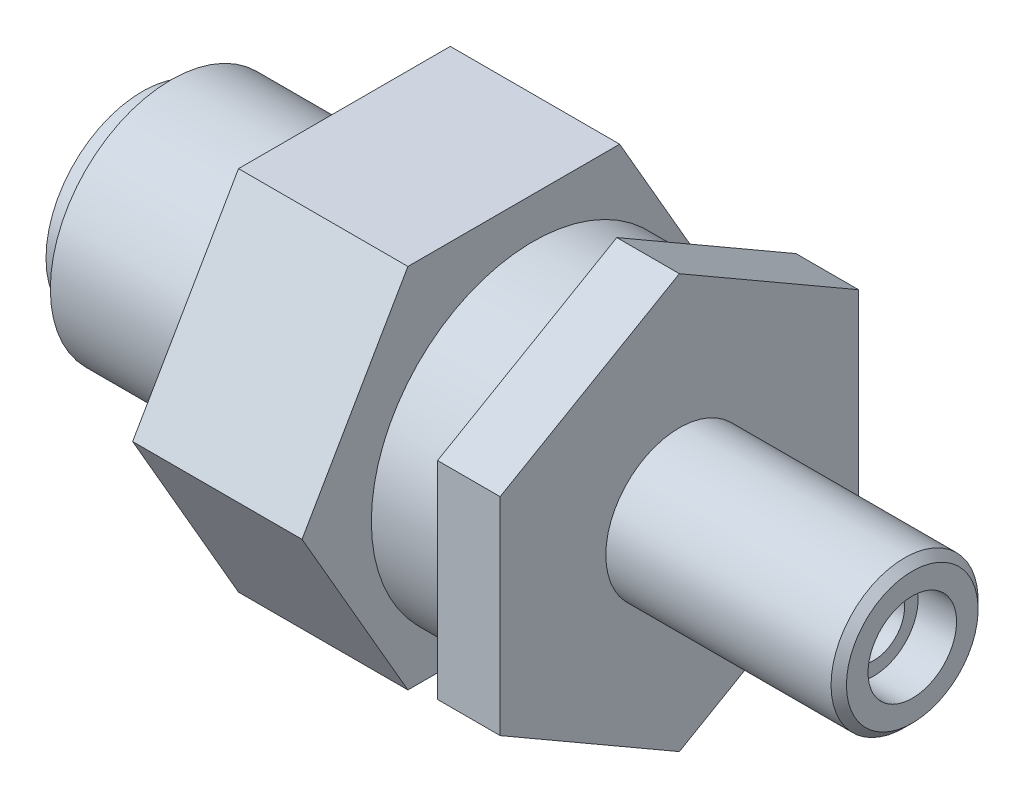
ISO-10303-21;
HEADER;
FILE_DESCRIPTION(('STEP AP214'),'2;1');
FILE_NAME('part.step','',(''),(''),'','','');
FILE_SCHEMA(('AUTOMOTIVE_DESIGN { 1 0 10303 214 1 1 1 1 }'));
ENDSEC;
DATA;
#1=APPLICATION_CONTEXT('core data for automotive mechanical design processes');
#2=APPLICATION_PROTOCOL_DEFINITION('international standard','automotive_design',2000,#1);
#3=PRODUCT_CONTEXT('',#1,'mechanical');
#4=PRODUCT('Part','Part','',(#3));
#5=PRODUCT_RELATED_PRODUCT_CATEGORY('part','',(#4));
#6=PRODUCT_DEFINITION_FORMATION('','',#4);
#7=PRODUCT_DEFINITION_CONTEXT('part definition',#1,'design');
#8=PRODUCT_DEFINITION('design','',#6,#7);
#9=PRODUCT_DEFINITION_SHAPE('','',#8);
#10=(LENGTH_UNIT() NAMED_UNIT(*) SI_UNIT(.MILLI.,.METRE.));
#11=(NAMED_UNIT(*) PLANE_ANGLE_UNIT() SI_UNIT($,.RADIAN.));
#12=(NAMED_UNIT(*) SI_UNIT($,.STERADIAN.) SOLID_ANGLE_UNIT());
#13=UNCERTAINTY_MEASURE_WITH_UNIT(LENGTH_MEASURE(1.E-05),#10,'distance_accuracy_value','');
#14=(GEOMETRIC_REPRESENTATION_CONTEXT(3) GLOBAL_UNCERTAINTY_ASSIGNED_CONTEXT((#13)) GLOBAL_UNIT_ASSIGNED_CONTEXT((#10,
#11,#12)) REPRESENTATION_CONTEXT('',''));
#15=CARTESIAN_POINT('',(0.,0.,0.));
#16=DIRECTION('',(0.,0.,1.));
#17=DIRECTION('',(1.,0.,0.));
#18=AXIS2_PLACEMENT_3D('',#15,#16,#17);
#19=CARTESIAN_POINT('',(10.5000000000003,8.00000000000002,-9.99200722162641E-13));
#20=DIRECTION('',(1.,0.,0.));
#21=DIRECTION('',(0.,0.,-0.999999999999998));
#22=AXIS2_PLACEMENT_3D('',#19,#20,#21);
#23=PLANE('',#22);
#24=CARTESIAN_POINT('',(10.5000000000009,0.,-3.33066907387547E-13));
#25=DIRECTION('',(-1.,0.,0.));
#26=DIRECTION('',(0.,0.,0.999999999999998));
#27=AXIS2_PLACEMENT_3D('',#24,#25,#26);
#28=CIRCLE('',#27,8.);
#29=CARTESIAN_POINT('',(10.5000000000009,0.,7.99999999999965));
#30=VERTEX_POINT('',#29);
#31=EDGE_CURVE('E237',#30,#30,#28,.T.);
#32=ORIENTED_EDGE('',*,*,#31,.F.);
#33=EDGE_LOOP('',(#32));
#34=FACE_BOUND('',#33,.T.);
#35=DIRECTION('',(0.,-0.866025403784439,-0.499999999999999));
#36=VECTOR('',#35,1.);
#37=CARTESIAN_POINT('',(10.5,-2.77555756156289E-13,-11.0000000000002));
#38=LINE('',#37,#36);
#39=CARTESIAN_POINT('',(10.5000000000008,9.52627944162869,-5.49999999999995));
#40=VERTEX_POINT('',#39);
#41=CARTESIAN_POINT('',(10.5,-2.77555756156289E-13,-11.0000000000002));
#42=VERTEX_POINT('',#41);
#43=EDGE_CURVE('E139',#40,#42,#38,.T.);
#44=ORIENTED_EDGE('',*,*,#43,.T.);
#45=DIRECTION('',(0.,-0.866025403784439,0.499999999999999));
#46=VECTOR('',#45,1.);
#47=CARTESIAN_POINT('',(10.5000000000013,-9.52627944162922,-5.50000000000028));
#48=LINE('',#47,#46);
#49=CARTESIAN_POINT('',(10.5000000000012,-9.52627944162893,-5.5000000000005));
#50=VERTEX_POINT('',#49);
#51=EDGE_CURVE('E148',#42,#50,#48,.T.);
#52=ORIENTED_EDGE('',*,*,#51,.T.);
#53=DIRECTION('',(0.,0.,0.999999999999999));
#54=VECTOR('',#53,1.);
#55=CARTESIAN_POINT('',(10.5000000000003,-9.52627944162876,5.49999999999973));
#56=LINE('',#55,#54);
#57=CARTESIAN_POINT('',(10.5000000000003,-9.52627944162876,5.49999999999973));
#58=VERTEX_POINT('',#57);
#59=EDGE_CURVE('E545',#50,#58,#56,.T.);
#60=ORIENTED_EDGE('',*,*,#59,.T.);
#61=DIRECTION('',(0.,0.866025403784438,0.499999999999999));
#62=VECTOR('',#61,1.);
#63=CARTESIAN_POINT('',(10.4999999999995,1.66533453693773E-13,10.9999999999995));
#64=LINE('',#63,#62);
#65=CARTESIAN_POINT('',(10.4999999999995,1.66533453693773E-13,10.9999999999995));
#66=VERTEX_POINT('',#65);
#67=EDGE_CURVE('E149',#58,#66,#64,.T.);
#68=ORIENTED_EDGE('',*,*,#67,.T.);
#69=DIRECTION('',(0.,0.866025403784439,-0.499999999999999));
#70=VECTOR('',#69,1.);
#71=CARTESIAN_POINT('',(10.5,9.52627944162873,5.49999999999995));
#72=LINE('',#71,#70);
#73=CARTESIAN_POINT('',(10.5,9.52627944162873,5.49999999999995));
#74=VERTEX_POINT('',#73);
#75=EDGE_CURVE('E559',#66,#74,#72,.T.);
#76=ORIENTED_EDGE('',*,*,#75,.T.);
#77=DIRECTION('',(0.,0.,-0.999999999999998));
#78=VECTOR('',#77,1.);
#79=CARTESIAN_POINT('',(10.5000000000008,9.52627944162869,-5.49999999999995));
#80=LINE('',#79,#78);
#81=EDGE_CURVE('E552',#74,#40,#80,.T.);
#82=ORIENTED_EDGE('',*,*,#81,.T.);
#83=EDGE_LOOP('',(#44,#52,#60,#68,#76,#82));
#84=FACE_BOUND('',#83,.T.);
#85=ADVANCED_FACE('F38',(#34,#84),#23,.F.);
#86=CARTESIAN_POINT('',(19.2999999999998,10.9999999999995,-4.44089209850063E-13));
#87=DIRECTION('',(-1.,0.,0.));
#88=DIRECTION('',(0.,0.,0.999999999999998));
#89=AXIS2_PLACEMENT_3D('',#86,#87,#88);
#90=PLANE('',#89);
#91=CARTESIAN_POINT('',(19.2999999999999,1.11022302462516E-13,-1.11022302462516E-13));
#92=DIRECTION('',(-1.,0.,0.));
#93=DIRECTION('',(0.,0.,0.999999999999998));
#94=AXIS2_PLACEMENT_3D('',#91,#92,#93);
#95=CIRCLE('',#94,6.5);
#96=CARTESIAN_POINT('',(19.2999999999999,1.09037778805998E-13,6.49999999999988));
#97=VERTEX_POINT('',#96);
#98=EDGE_CURVE('E234',#97,#97,#95,.T.);
#99=ORIENTED_EDGE('',*,*,#98,.T.);
#100=EDGE_LOOP('',(#99));
#101=FACE_BOUND('',#100,.T.);
#102=DIRECTION('',(0.,0.866025403784438,0.499999999999999));
#103=VECTOR('',#102,1.);
#104=CARTESIAN_POINT('',(19.2999999999999,-3.05311331771918E-13,-11.));
#105=LINE('',#104,#103);
#106=CARTESIAN_POINT('',(19.2999999999999,-3.05311331771918E-13,-11.));
#107=VERTEX_POINT('',#106);
#108=CARTESIAN_POINT('',(19.2999999999998,9.52627944162836,-5.49999999999995));
#109=VERTEX_POINT('',#108);
#110=EDGE_CURVE('E128',#107,#109,#105,.T.);
#111=ORIENTED_EDGE('',*,*,#110,.T.);
#112=DIRECTION('',(0.,0.,0.999999999999998));
#113=VECTOR('',#112,1.);
#114=CARTESIAN_POINT('',(19.2999999999998,9.52627944162836,-5.49999999999995));
#115=LINE('',#114,#113);
#116=CARTESIAN_POINT('',(19.2999999999999,9.5262794416287,5.49999999999962));
#117=VERTEX_POINT('',#116);
#118=EDGE_CURVE('E547',#109,#117,#115,.T.);
#119=ORIENTED_EDGE('',*,*,#118,.T.);
#120=DIRECTION('',(0.,-0.866025403784438,0.499999999999999));
#121=VECTOR('',#120,1.);
#122=CARTESIAN_POINT('',(19.2999999999999,9.5262794416287,5.49999999999962));
#123=LINE('',#122,#121);
#124=CARTESIAN_POINT('',(19.2999999999998,-1.66533453693773E-13,10.9999999999996));
#125=VERTEX_POINT('',#124);
#126=EDGE_CURVE('E53',#117,#125,#123,.T.);
#127=ORIENTED_EDGE('',*,*,#126,.T.);
#128=DIRECTION('',(0.,-0.866025403784438,-0.499999999999999));
#129=VECTOR('',#128,1.);
#130=CARTESIAN_POINT('',(19.2999999999998,-1.66533453693773E-13,10.9999999999996));
#131=LINE('',#130,#129);
#132=CARTESIAN_POINT('',(19.2999999999998,-9.52627944162865,5.49999999999917));
#133=VERTEX_POINT('',#132);
#134=EDGE_CURVE('E539',#125,#133,#131,.T.);
#135=ORIENTED_EDGE('',*,*,#134,.T.);
#136=DIRECTION('',(0.,0.,-0.999999999999999));
#137=VECTOR('',#136,1.);
#138=CARTESIAN_POINT('',(19.2999999999998,-9.52627944162865,5.49999999999917));
#139=LINE('',#138,#137);
#140=CARTESIAN_POINT('',(19.3000000000003,-9.52627944162872,-5.50000000000062));
#141=VERTEX_POINT('',#140);
#142=EDGE_CURVE('E155',#133,#141,#139,.T.);
#143=ORIENTED_EDGE('',*,*,#142,.T.);
#144=DIRECTION('',(0.,0.866025403784439,-0.499999999999999));
#145=VECTOR('',#144,1.);
#146=CARTESIAN_POINT('',(19.3000000000003,-9.52627944162918,-5.50000000000006));
#147=LINE('',#146,#145);
#148=EDGE_CURVE('E146',#141,#107,#147,.T.);
#149=ORIENTED_EDGE('',*,*,#148,.T.);
#150=EDGE_LOOP('',(#111,#119,#127,#135,#143,#149));
#151=FACE_BOUND('',#150,.T.);
#152=ADVANCED_FACE('F152',(#101,#151),#90,.F.);
#153=CARTESIAN_POINT('',(24.6500000000003,8.39999999999938,-4.44089209850063E-13));
#154=DIRECTION('',(1.,0.,0.));
#155=DIRECTION('',(0.,0.,-0.999999999999998));
#156=AXIS2_PLACEMENT_3D('',#153,#154,#155);
#157=PLANE('',#156);
#158=CARTESIAN_POINT('',(24.6500000000003,-2.63677968348475E-13,-1.11022302462516E-13));
#159=DIRECTION('',(-1.,0.,0.));
#160=DIRECTION('',(0.,0.,0.999999999999998));
#161=AXIS2_PLACEMENT_3D('',#158,#159,#160);
#162=CIRCLE('',#161,8.4);
#163=CARTESIAN_POINT('',(24.6500000000003,-2.66242583535359E-13,8.39999999999987));
#164=VERTEX_POINT('',#163);
#165=EDGE_CURVE('E225',#164,#164,#162,.T.);
#166=ORIENTED_EDGE('',*,*,#165,.F.);
#167=EDGE_LOOP('',(#166));
#168=FACE_BOUND('',#167,.T.);
#169=DIRECTION('',(0.,-0.999999999999999,0.));
#170=VECTOR('',#169,1.);
#171=CARTESIAN_POINT('',(24.6500000000002,-5.37500000000048,-9.30977309068304));
#172=LINE('',#171,#170);
#173=CARTESIAN_POINT('',(24.6500000000007,5.37499999999991,-9.30977309068337));
#174=VERTEX_POINT('',#173);
#175=CARTESIAN_POINT('',(24.6500000000002,-5.37500000000048,-9.30977309068304));
#176=VERTEX_POINT('',#175);
#177=EDGE_CURVE('E159',#174,#176,#172,.T.);
#178=ORIENTED_EDGE('',*,*,#177,.T.);
#179=DIRECTION('',(0.,-0.5,0.866025403784439));
#180=VECTOR('',#179,1.);
#181=CARTESIAN_POINT('',(24.6499999999998,-10.7500000000005,-4.44089209850063E-13));
#182=LINE('',#181,#180);
#183=CARTESIAN_POINT('',(24.6499999999998,-10.7500000000005,-4.44089209850063E-13));
#184=VERTEX_POINT('',#183);
#185=EDGE_CURVE('E204',#176,#184,#182,.T.);
#186=ORIENTED_EDGE('',*,*,#185,.T.);
#187=DIRECTION('',(0.,0.5,0.866025403784437));
#188=VECTOR('',#187,1.);
#189=CARTESIAN_POINT('',(24.6499999999997,-5.37499999999996,9.30977309068259));
#190=LINE('',#189,#188);
#191=CARTESIAN_POINT('',(24.6499999999999,-5.37500000000027,9.30977309068237));
#192=VERTEX_POINT('',#191);
#193=EDGE_CURVE('E188',#184,#192,#190,.T.);
#194=ORIENTED_EDGE('',*,*,#193,.T.);
#195=DIRECTION('',(0.,1.,0.));
#196=VECTOR('',#195,1.);
#197=CARTESIAN_POINT('',(24.6500000000003,5.37500000000032,9.30977309068259));
#198=LINE('',#197,#196);
#199=CARTESIAN_POINT('',(24.6500000000003,5.37500000000032,9.30977309068259));
#200=VERTEX_POINT('',#199);
#201=EDGE_CURVE('E171',#192,#200,#198,.T.);
#202=ORIENTED_EDGE('',*,*,#201,.T.);
#203=DIRECTION('',(0.,0.5,-0.866025403784438));
#204=VECTOR('',#203,1.);
#205=CARTESIAN_POINT('',(24.6500000000003,10.7499999999997,-8.88178419700125E-13));
#206=LINE('',#205,#204);
#207=CARTESIAN_POINT('',(24.6500000000007,10.7500000000006,-7.7715611723761E-13));
#208=VERTEX_POINT('',#207);
#209=EDGE_CURVE('E180',#200,#208,#206,.T.);
#210=ORIENTED_EDGE('',*,*,#209,.T.);
#211=DIRECTION('',(0.,-0.5,-0.866025403784437));
#212=VECTOR('',#211,1.);
#213=CARTESIAN_POINT('',(24.6499999999998,5.37500000000021,-9.30977309068315));
#214=LINE('',#213,#212);
#215=EDGE_CURVE('E189',#208,#174,#214,.T.);
#216=ORIENTED_EDGE('',*,*,#215,.T.);
#217=EDGE_LOOP('',(#178,#186,#194,#202,#210,#216));
#218=FACE_BOUND('',#217,.T.);
#219=ADVANCED_FACE('F281',(#168,#218),#157,.F.);
#220=CARTESIAN_POINT('',(27.9000000000006,10.7499999999995,-3.33066907387547E-13));
#221=DIRECTION('',(-1.,0.,0.));
#222=DIRECTION('',(0.,0.,0.999999999999998));
#223=AXIS2_PLACEMENT_3D('',#220,#221,#222);
#224=PLANE('',#223);
#225=CARTESIAN_POINT('',(27.9000000000002,0.,-4.44089209850063E-13));
#226=DIRECTION('',(-1.,0.,0.));
#227=DIRECTION('',(0.,0.,0.999999999999998));
#228=AXIS2_PLACEMENT_3D('',#225,#226,#227);
#229=CIRCLE('',#228,3.82);
#230=CARTESIAN_POINT('',(27.9000000000002,0.,3.81999999999955));
#231=VERTEX_POINT('',#230);
#232=EDGE_CURVE('E222',#231,#231,#229,.T.);
#233=ORIENTED_EDGE('',*,*,#232,.T.);
#234=EDGE_LOOP('',(#233));
#235=FACE_BOUND('',#234,.T.);
#236=DIRECTION('',(0.,0.999999999999999,0.));
#237=VECTOR('',#236,1.);
#238=CARTESIAN_POINT('',(27.9000000000008,-5.37499999999988,-9.30977309068337));
#239=LINE('',#238,#237);
#240=CARTESIAN_POINT('',(27.9000000000008,-5.37499999999988,-9.30977309068337));
#241=VERTEX_POINT('',#240);
#242=CARTESIAN_POINT('',(27.9000000000002,5.37499999999973,-9.30977309068293));
#243=VERTEX_POINT('',#242);
#244=EDGE_CURVE('E165',#241,#243,#239,.T.);
#245=ORIENTED_EDGE('',*,*,#244,.T.);
#246=DIRECTION('',(0.,0.499999999999999,0.866025403784437));
#247=VECTOR('',#246,1.);
#248=CARTESIAN_POINT('',(27.9000000000002,5.37499999999973,-9.30977309068293));
#249=LINE('',#248,#247);
#250=CARTESIAN_POINT('',(27.9000000000006,10.7499999999995,-3.33066907387547E-13));
#251=VERTEX_POINT('',#250);
#252=EDGE_CURVE('E185',#243,#251,#249,.T.);
#253=ORIENTED_EDGE('',*,*,#252,.T.);
#254=DIRECTION('',(0.,-0.5,0.866025403784437));
#255=VECTOR('',#254,1.);
#256=CARTESIAN_POINT('',(27.9000000000006,10.7499999999995,-3.33066907387547E-13));
#257=LINE('',#256,#255);
#258=CARTESIAN_POINT('',(27.9000000000011,5.3749999999998,9.30977309068248));
#259=VERTEX_POINT('',#258);
#260=EDGE_CURVE('E61',#251,#259,#257,.T.);
#261=ORIENTED_EDGE('',*,*,#260,.T.);
#262=DIRECTION('',(0.,-1.,0.));
#263=VECTOR('',#262,1.);
#264=CARTESIAN_POINT('',(27.9000000000002,5.37499999999973,9.30977309068259));
#265=LINE('',#264,#263);
#266=CARTESIAN_POINT('',(27.8999999999998,-5.37499999999994,9.30977309068248));
#267=VERTEX_POINT('',#266);
#268=EDGE_CURVE('E173',#259,#267,#265,.T.);
#269=ORIENTED_EDGE('',*,*,#268,.T.);
#270=DIRECTION('',(0.,-0.5,-0.866025403784437));
#271=VECTOR('',#270,1.);
#272=CARTESIAN_POINT('',(27.8999999999998,-5.37499999999994,9.30977309068248));
#273=LINE('',#272,#271);
#274=CARTESIAN_POINT('',(27.9000000000011,-10.7500000000001,-3.33066907387547E-13));
#275=VERTEX_POINT('',#274);
#276=EDGE_CURVE('E197',#267,#275,#273,.T.);
#277=ORIENTED_EDGE('',*,*,#276,.T.);
#278=DIRECTION('',(0.,0.5,-0.866025403784438));
#279=VECTOR('',#278,1.);
#280=CARTESIAN_POINT('',(27.9000000000011,-10.7500000000001,-3.33066907387547E-13));
#281=LINE('',#280,#279);
#282=EDGE_CURVE('E207',#275,#241,#281,.T.);
#283=ORIENTED_EDGE('',*,*,#282,.T.);
#284=EDGE_LOOP('',(#245,#253,#261,#269,#277,#283));
#285=FACE_BOUND('',#284,.T.);
#286=ADVANCED_FACE('F310',(#235,#285),#224,.F.);
#287=CARTESIAN_POINT('',(0.,0.,0.));
#288=DIRECTION('',(1.,0.,0.));
#289=DIRECTION('',(0.,0.,-0.999999999999998));
#290=AXIS2_PLACEMENT_3D('',#287,#288,#289);
#291=PLANE('',#290);
#292=CARTESIAN_POINT('',(0.,0.,0.));
#293=DIRECTION('',(-1.,0.,0.));
#294=DIRECTION('',(0.,0.,0.999999999999998));
#295=AXIS2_PLACEMENT_3D('',#292,#293,#294);
#296=CIRCLE('',#295,5.);
#297=CARTESIAN_POINT('',(0.,0.,4.99999999999999));
#298=VERTEX_POINT('',#297);
#299=EDGE_CURVE('E252',#298,#298,#296,.T.);
#300=ORIENTED_EDGE('',*,*,#299,.T.);
#301=EDGE_LOOP('',(#300));
#302=FACE_BOUND('',#301,.T.);
#303=ADVANCED_FACE('F307',(#302),#291,.F.);
#304=CARTESIAN_POINT('',(0.,0.,0.));
#305=DIRECTION('',(-1.,0.,0.));
#306=DIRECTION('',(0.,0.,0.999999999999998));
#307=AXIS2_PLACEMENT_3D('',#304,#305,#306);
#308=CYLINDRICAL_SURFACE('',#307,5.);
#309=ORIENTED_EDGE('',*,*,#299,.F.);
#310=EDGE_LOOP('',(#309));
#311=FACE_BOUND('',#310,.T.);
#312=CARTESIAN_POINT('',(1.50000000000006,0.,-1.11022302462516E-13));
#313=DIRECTION('',(-1.,0.,0.));
#314=DIRECTION('',(0.,0.,0.999999999999998));
#315=AXIS2_PLACEMENT_3D('',#312,#313,#314);
#316=CIRCLE('',#315,5.);
#317=CARTESIAN_POINT('',(1.50000000000006,0.,4.99999999999988));
#318=VERTEX_POINT('',#317);
#319=EDGE_CURVE('E249',#318,#318,#316,.T.);
#320=ORIENTED_EDGE('',*,*,#319,.T.);
#321=EDGE_LOOP('',(#320));
#322=FACE_BOUND('',#321,.T.);
#323=ADVANCED_FACE('F304',(#311,#322),#308,.T.);
#324=CARTESIAN_POINT('',(1.50000000000097,4.99999999999967,-8.88178419700125E-13));
#325=DIRECTION('',(1.,0.,0.));
#326=DIRECTION('',(0.,0.,-0.999999999999998));
#327=AXIS2_PLACEMENT_3D('',#324,#325,#326);
#328=PLANE('',#327);
#329=ORIENTED_EDGE('',*,*,#319,.F.);
#330=EDGE_LOOP('',(#329));
#331=FACE_BOUND('',#330,.T.);
#332=CARTESIAN_POINT('',(1.50000000000006,0.,-1.11022302462516E-13));
#333=DIRECTION('',(-1.,0.,0.));
#334=DIRECTION('',(0.,0.,0.999999999999998));
#335=AXIS2_PLACEMENT_3D('',#332,#333,#334);
#336=CIRCLE('',#335,6.275);
#337=CARTESIAN_POINT('',(1.50000000000006,0.,6.27499999999988));
#338=VERTEX_POINT('',#337);
#339=EDGE_CURVE('E246',#338,#338,#336,.T.);
#340=ORIENTED_EDGE('',*,*,#339,.T.);
#341=EDGE_LOOP('',(#340));
#342=FACE_BOUND('',#341,.T.);
#343=ADVANCED_FACE('F300',(#331,#342),#328,.F.);
#344=CARTESIAN_POINT('',(0.,0.,0.));
#345=DIRECTION('',(-1.,0.,0.));
#346=DIRECTION('',(0.,0.,0.999999999999998));
#347=AXIS2_PLACEMENT_3D('',#344,#345,#346);
#348=CYLINDRICAL_SURFACE('',#347,6.275);
#349=ORIENTED_EDGE('',*,*,#339,.F.);
#350=EDGE_LOOP('',(#349));
#351=FACE_BOUND('',#350,.T.);
#352=CARTESIAN_POINT('',(11.0000000000001,3.7470027081099E-13,-7.7715611723761E-13));
#353=DIRECTION('',(-1.,0.,0.));
#354=DIRECTION('',(0.,0.,0.999999999999998));
#355=AXIS2_PLACEMENT_3D('',#352,#353,#354);
#356=CIRCLE('',#355,6.275);
#357=CARTESIAN_POINT('',(11.0000000000001,3.72784442204122E-13,6.27499999999921));
#358=VERTEX_POINT('',#357);
#359=EDGE_CURVE('E243',#358,#358,#356,.T.);
#360=ORIENTED_EDGE('',*,*,#359,.T.);
#361=EDGE_LOOP('',(#360));
#362=FACE_BOUND('',#361,.T.);
#363=ADVANCED_FACE('F296',(#351,#362),#348,.T.);
#364=CARTESIAN_POINT('',(11.0000000000006,6.27500000000024,-3.33066907387547E-13));
#365=DIRECTION('',(1.,0.,0.));
#366=DIRECTION('',(0.,0.,-0.999999999999998));
#367=AXIS2_PLACEMENT_3D('',#364,#365,#366);
#368=PLANE('',#367);
#369=ORIENTED_EDGE('',*,*,#359,.F.);
#370=EDGE_LOOP('',(#369));
#371=FACE_BOUND('',#370,.T.);
#372=CARTESIAN_POINT('',(11.0000000000001,3.7470027081099E-13,-7.7715611723761E-13));
#373=DIRECTION('',(-1.,0.,0.));
#374=DIRECTION('',(0.,0.,0.999999999999998));
#375=AXIS2_PLACEMENT_3D('',#372,#373,#374);
#376=CIRCLE('',#375,8.);
#377=CARTESIAN_POINT('',(11.0000000000001,3.72257780156815E-13,7.99999999999921));
#378=VERTEX_POINT('',#377);
#379=EDGE_CURVE('E240',#378,#378,#376,.T.);
#380=ORIENTED_EDGE('',*,*,#379,.T.);
#381=EDGE_LOOP('',(#380));
#382=FACE_BOUND('',#381,.T.);
#383=ADVANCED_FACE('F292',(#371,#382),#368,.F.);
#384=CARTESIAN_POINT('',(0.,0.,0.));
#385=DIRECTION('',(-1.,0.,0.));
#386=DIRECTION('',(0.,0.,0.999999999999998));
#387=AXIS2_PLACEMENT_3D('',#384,#385,#386);
#388=CYLINDRICAL_SURFACE('',#387,8.);
#389=ORIENTED_EDGE('',*,*,#379,.F.);
#390=EDGE_LOOP('',(#389));
#391=FACE_BOUND('',#390,.T.);
#392=ORIENTED_EDGE('',*,*,#31,.T.);
#393=EDGE_LOOP('',(#392));
#394=FACE_BOUND('',#393,.T.);
#395=ADVANCED_FACE('F288',(#391,#394),#388,.F.);
#396=CARTESIAN_POINT('',(0.,0.,0.));
#397=DIRECTION('',(-1.,0.,0.));
#398=DIRECTION('',(0.,0.,0.999999999999998));
#399=AXIS2_PLACEMENT_3D('',#396,#397,#398);
#400=CYLINDRICAL_SURFACE('',#399,6.5);
#401=ORIENTED_EDGE('',*,*,#98,.F.);
#402=EDGE_LOOP('',(#401));
#403=FACE_BOUND('',#402,.T.);
#404=CARTESIAN_POINT('',(20.3000000000002,0.,-2.22044604925031E-13));
#405=DIRECTION('',(-1.,0.,0.));
#406=DIRECTION('',(0.,0.,0.999999999999998));
#407=AXIS2_PLACEMENT_3D('',#404,#405,#406);
#408=CIRCLE('',#407,6.5);
#409=CARTESIAN_POINT('',(20.3000000000002,0.,6.49999999999977));
#410=VERTEX_POINT('',#409);
#411=EDGE_CURVE('E231',#410,#410,#408,.T.);
#412=ORIENTED_EDGE('',*,*,#411,.T.);
#413=EDGE_LOOP('',(#412));
#414=FACE_BOUND('',#413,.T.);
#415=ADVANCED_FACE('F291',(#403,#414),#400,.T.);
#416=CARTESIAN_POINT('',(20.3000000000002,6.50000000000001,-5.55111512312578E-13));
#417=DIRECTION('',(1.,0.,0.));
#418=DIRECTION('',(0.,0.,-0.999999999999998));
#419=AXIS2_PLACEMENT_3D('',#416,#417,#418);
#420=PLANE('',#419);
#421=ORIENTED_EDGE('',*,*,#411,.F.);
#422=EDGE_LOOP('',(#421));
#423=FACE_BOUND('',#422,.T.);
#424=CARTESIAN_POINT('',(20.3000000000002,0.,-2.22044604925031E-13));
#425=DIRECTION('',(-1.,0.,0.));
#426=DIRECTION('',(0.,0.,0.999999999999998));
#427=AXIS2_PLACEMENT_3D('',#424,#425,#426);
#428=CIRCLE('',#427,8.4);
#429=CARTESIAN_POINT('',(20.3000000000002,0.,8.39999999999976));
#430=VERTEX_POINT('',#429);
#431=EDGE_CURVE('E228',#430,#430,#428,.T.);
#432=ORIENTED_EDGE('',*,*,#431,.T.);
#433=EDGE_LOOP('',(#432));
#434=FACE_BOUND('',#433,.T.);
#435=ADVANCED_FACE('F339',(#423,#434),#420,.F.);
#436=CARTESIAN_POINT('',(0.,0.,0.));
#437=DIRECTION('',(-1.,0.,0.));
#438=DIRECTION('',(0.,0.,0.999999999999998));
#439=AXIS2_PLACEMENT_3D('',#436,#437,#438);
#440=CYLINDRICAL_SURFACE('',#439,8.4);
#441=ORIENTED_EDGE('',*,*,#431,.F.);
#442=EDGE_LOOP('',(#441));
#443=FACE_BOUND('',#442,.T.);
#444=ORIENTED_EDGE('',*,*,#165,.T.);
#445=EDGE_LOOP('',(#444));
#446=FACE_BOUND('',#445,.T.);
#447=ADVANCED_FACE('F336',(#443,#446),#440,.T.);
#448=CARTESIAN_POINT('',(0.,0.,0.));
#449=DIRECTION('',(-1.,0.,0.));
#450=DIRECTION('',(0.,0.,0.999999999999998));
#451=AXIS2_PLACEMENT_3D('',#448,#449,#450);
#452=CYLINDRICAL_SURFACE('',#451,3.82);
#453=CARTESIAN_POINT('',(39.6000000000005,0.,-4.44089209850063E-13));
#454=DIRECTION('',(-1.,0.,0.));
#455=DIRECTION('',(0.,0.,0.999999999999998));
#456=AXIS2_PLACEMENT_3D('',#453,#454,#455);
#457=CIRCLE('',#456,3.82);
#458=CARTESIAN_POINT('',(39.6000000000005,0.,3.81999999999955));
#459=VERTEX_POINT('',#458);
#460=EDGE_CURVE('E46',#459,#459,#457,.T.);
#461=ORIENTED_EDGE('',*,*,#460,.T.);
#462=EDGE_LOOP('',(#461));
#463=FACE_BOUND('',#462,.T.);
#464=ORIENTED_EDGE('',*,*,#232,.F.);
#465=EDGE_LOOP('',(#464));
#466=FACE_BOUND('',#465,.T.);
#467=ADVANCED_FACE('F257',(#463,#466),#452,.T.);
#468=CARTESIAN_POINT('',(40.0000000000004,3.81999999999995,-3.33066907387547E-13));
#469=DIRECTION('',(-1.,0.,0.));
#470=DIRECTION('',(0.,0.,0.999999999999998));
#471=AXIS2_PLACEMENT_3D('',#468,#469,#470);
#472=PLANE('',#471);
#473=CARTESIAN_POINT('',(40.0000000000005,-4.16333634234434E-13,-4.44089209850063E-13));
#474=DIRECTION('',(-1.,0.,0.));
#475=DIRECTION('',(0.,0.,0.999999999999998));
#476=AXIS2_PLACEMENT_3D('',#473,#474,#475);
#477=CIRCLE('',#476,3.42000000000001);
#478=CARTESIAN_POINT('',(40.0000000000005,-4.17377798989094E-13,3.41999999999956));
#479=VERTEX_POINT('',#478);
#480=EDGE_CURVE('E11',#479,#479,#477,.F.);
#481=ORIENTED_EDGE('',*,*,#480,.T.);
#482=EDGE_LOOP('',(#481));
#483=FACE_BOUND('',#482,.T.);
#484=CARTESIAN_POINT('',(40.0000000000005,-4.16333634234434E-13,-4.44089209850063E-13));
#485=DIRECTION('',(-1.,0.,0.));
#486=DIRECTION('',(0.,0.,0.999999999999998));
#487=AXIS2_PLACEMENT_3D('',#484,#485,#486);
#488=CIRCLE('',#487,2.3);
#489=CARTESIAN_POINT('',(40.0000000000005,-4.17035850297509E-13,2.29999999999955));
#490=VERTEX_POINT('',#489);
#491=EDGE_CURVE('E219',#490,#490,#488,.T.);
#492=ORIENTED_EDGE('',*,*,#491,.T.);
#493=EDGE_LOOP('',(#492));
#494=FACE_BOUND('',#493,.T.);
#495=ADVANCED_FACE('F396',(#483,#494),#472,.F.);
#496=CARTESIAN_POINT('',(0.,0.,0.));
#497=DIRECTION('',(-1.,0.,0.));
#498=DIRECTION('',(0.,0.,0.999999999999998));
#499=AXIS2_PLACEMENT_3D('',#496,#497,#498);
#500=CYLINDRICAL_SURFACE('',#499,2.3);
#501=ORIENTED_EDGE('',*,*,#491,.F.);
#502=EDGE_LOOP('',(#501));
#503=FACE_BOUND('',#502,.T.);
#504=CARTESIAN_POINT('',(37.9999999999997,1.11022302462516E-13,1.11022302462516E-13));
#505=DIRECTION('',(-1.,0.,0.));
#506=DIRECTION('',(0.,0.,0.999999999999998));
#507=AXIS2_PLACEMENT_3D('',#504,#505,#506);
#508=CIRCLE('',#507,2.3);
#509=CARTESIAN_POINT('',(37.9999999999997,1.1032008639944E-13,2.3000000000001));
#510=VERTEX_POINT('',#509);
#511=EDGE_CURVE('E216',#510,#510,#508,.T.);
#512=ORIENTED_EDGE('',*,*,#511,.T.);
#513=EDGE_LOOP('',(#512));
#514=FACE_BOUND('',#513,.T.);
#515=ADVANCED_FACE('F393',(#503,#514),#500,.F.);
#516=CARTESIAN_POINT('',(38.0000000000003,2.29999999999983,-4.44089209850063E-13));
#517=DIRECTION('',(-1.,0.,0.));
#518=DIRECTION('',(0.,0.,0.999999999999998));
#519=AXIS2_PLACEMENT_3D('',#516,#517,#518);
#520=PLANE('',#519);
#521=ORIENTED_EDGE('',*,*,#511,.F.);
#522=EDGE_LOOP('',(#521));
#523=FACE_BOUND('',#522,.T.);
#524=CARTESIAN_POINT('',(37.9999999999997,1.11022302462516E-13,1.11022302462516E-13));
#525=DIRECTION('',(-1.,0.,0.));
#526=DIRECTION('',(0.,0.,0.999999999999998));
#527=AXIS2_PLACEMENT_3D('',#524,#525,#526);
#528=CIRCLE('',#527,1.6);
#529=CARTESIAN_POINT('',(37.9999999999997,1.10533804331681E-13,1.6000000000001));
#530=VERTEX_POINT('',#529);
#531=EDGE_CURVE('E213',#530,#530,#528,.T.);
#532=ORIENTED_EDGE('',*,*,#531,.T.);
#533=EDGE_LOOP('',(#532));
#534=FACE_BOUND('',#533,.T.);
#535=ADVANCED_FACE('F389',(#523,#534),#520,.F.);
#536=CARTESIAN_POINT('',(0.,0.,0.));
#537=DIRECTION('',(-1.,0.,0.));
#538=DIRECTION('',(0.,0.,0.999999999999998));
#539=AXIS2_PLACEMENT_3D('',#536,#537,#538);
#540=CYLINDRICAL_SURFACE('',#539,1.6);
#541=ORIENTED_EDGE('',*,*,#531,.F.);
#542=EDGE_LOOP('',(#541));
#543=FACE_BOUND('',#542,.T.);
#544=CARTESIAN_POINT('',(12.0000000000013,0.,-3.33066907387547E-13));
#545=DIRECTION('',(-1.,0.,0.));
#546=DIRECTION('',(0.,0.,0.999999999999998));
#547=AXIS2_PLACEMENT_3D('',#544,#545,#546);
#548=CIRCLE('',#547,1.6);
#549=CARTESIAN_POINT('',(12.0000000000013,0.,1.59999999999966));
#550=VERTEX_POINT('',#549);
#551=EDGE_CURVE('E210',#550,#550,#548,.T.);
#552=ORIENTED_EDGE('',*,*,#551,.T.);
#553=EDGE_LOOP('',(#552));
#554=FACE_BOUND('',#553,.T.);
#555=ADVANCED_FACE('F271',(#543,#554),#540,.F.);
#556=CARTESIAN_POINT('',(12.0000000000001,1.60000000000014,-4.44089209850063E-13));
#557=DIRECTION('',(-1.,0.,0.));
#558=DIRECTION('',(0.,0.,0.999999999999998));
#559=AXIS2_PLACEMENT_3D('',#556,#557,#558);
#560=PLANE('',#559);
#561=ORIENTED_EDGE('',*,*,#551,.F.);
#562=EDGE_LOOP('',(#561));
#563=FACE_BOUND('',#562,.T.);
#564=ADVANCED_FACE('F262',(#563),#560,.F.);
#565=CARTESIAN_POINT('',(39.6000000000005,0.,-4.44089209850063E-13));
#566=DIRECTION('',(-1.,0.,0.));
#567=DIRECTION('',(0.,0.,0.999999999999998));
#568=AXIS2_PLACEMENT_3D('',#565,#566,#567);
#569=CONICAL_SURFACE('',#568,3.82,0.785398163397443);
#570=ORIENTED_EDGE('',*,*,#480,.F.);
#571=EDGE_LOOP('',(#570));
#572=FACE_BOUND('',#571,.T.);
#573=ORIENTED_EDGE('',*,*,#460,.F.);
#574=EDGE_LOOP('',(#573));
#575=FACE_BOUND('',#574,.T.);
#576=ADVANCED_FACE('F40',(#572,#575),#569,.T.);
#577=CARTESIAN_POINT('',(-0.00100000000013978,-10.7499999999998,-4.44089209850063E-13));
#578=DIRECTION('',(0.,-0.866025403784438,-0.499999999999999));
#579=DIRECTION('',(0.,0.5,-0.866025403784439));
#580=AXIS2_PLACEMENT_3D('',#577,#578,#579);
#581=PLANE('',#580);
#582=DIRECTION('',(-1.,0.,0.));
#583=VECTOR('',#582,1.);
#584=CARTESIAN_POINT('',(8.04911692853238E-13,-5.37500000000056,-9.30977309068337));
#585=LINE('',#584,#583);
#586=EDGE_CURVE('E168',#241,#176,#585,.T.);
#587=ORIENTED_EDGE('',*,*,#586,.F.);
#588=ORIENTED_EDGE('',*,*,#282,.F.);
#589=DIRECTION('',(-1.,0.,0.));
#590=VECTOR('',#589,1.);
#591=CARTESIAN_POINT('',(8.32667268468867E-13,-10.7499999999998,-4.44089209850063E-13));
#592=LINE('',#591,#590);
#593=EDGE_CURVE('E196',#275,#184,#592,.T.);
#594=ORIENTED_EDGE('',*,*,#593,.T.);
#595=ORIENTED_EDGE('',*,*,#185,.F.);
#596=EDGE_LOOP('',(#587,#588,#594,#595));
#597=FACE_BOUND('',#596,.T.);
#598=ADVANCED_FACE('F261',(#597),#581,.T.);
#599=CARTESIAN_POINT('',(-0.000999999999695689,-5.3750000000001,9.30977309068248));
#600=DIRECTION('',(0.,-0.866025403784439,0.499999999999999));
#601=DIRECTION('',(0.,-0.5,-0.866025403784437));
#602=AXIS2_PLACEMENT_3D('',#599,#600,#601);
#603=PLANE('',#602);
#604=ORIENTED_EDGE('',*,*,#593,.F.);
#605=ORIENTED_EDGE('',*,*,#276,.F.);
#606=DIRECTION('',(-1.,0.,0.));
#607=VECTOR('',#606,1.);
#608=CARTESIAN_POINT('',(8.88178419700125E-13,-5.3750000000003,9.30977309068259));
#609=LINE('',#608,#607);
#610=EDGE_CURVE('E193',#267,#192,#609,.T.);
#611=ORIENTED_EDGE('',*,*,#610,.T.);
#612=ORIENTED_EDGE('',*,*,#193,.F.);
#613=EDGE_LOOP('',(#604,#605,#611,#612));
#614=FACE_BOUND('',#613,.T.);
#615=ADVANCED_FACE('F268',(#614),#603,.T.);
#616=CARTESIAN_POINT('',(-0.00100000000016753,5.37499999999996,-9.30977309068315));
#617=DIRECTION('',(0.,0.866025403784439,-0.499999999999999));
#618=DIRECTION('',(0.,0.5,0.866025403784437));
#619=AXIS2_PLACEMENT_3D('',#616,#617,#618);
#620=PLANE('',#619);
#621=DIRECTION('',(1.,0.,0.));
#622=VECTOR('',#621,1.);
#623=CARTESIAN_POINT('',(-0.000999999998835266,10.7499999999993,-5.55111512312578E-13));
#624=LINE('',#623,#622);
#625=EDGE_CURVE('E182',#208,#251,#624,.T.);
#626=ORIENTED_EDGE('',*,*,#625,.T.);
#627=ORIENTED_EDGE('',*,*,#252,.F.);
#628=DIRECTION('',(-1.,0.,0.));
#629=VECTOR('',#628,1.);
#630=CARTESIAN_POINT('',(7.7715611723761E-13,5.37499999999939,-9.30977309068315));
#631=LINE('',#630,#629);
#632=EDGE_CURVE('E156',#243,#174,#631,.T.);
#633=ORIENTED_EDGE('',*,*,#632,.T.);
#634=ORIENTED_EDGE('',*,*,#215,.F.);
#635=EDGE_LOOP('',(#626,#627,#633,#634));
#636=FACE_BOUND('',#635,.T.);
#637=ADVANCED_FACE('F367',(#636),#620,.T.);
#638=CARTESIAN_POINT('',(-0.000999999998835266,10.7499999999993,-5.55111512312578E-13));
#639=DIRECTION('',(0.,0.866025403784438,0.499999999999999));
#640=DIRECTION('',(0.,-0.5,0.866025403784438));
#641=AXIS2_PLACEMENT_3D('',#638,#639,#640);
#642=PLANE('',#641);
#643=DIRECTION('',(1.,0.,0.));
#644=VECTOR('',#643,1.);
#645=CARTESIAN_POINT('',(-0.000999999999334866,5.37500000000007,9.3097730906827));
#646=LINE('',#645,#644);
#647=EDGE_CURVE('E176',#200,#259,#646,.T.);
#648=ORIENTED_EDGE('',*,*,#647,.T.);
#649=ORIENTED_EDGE('',*,*,#260,.F.);
#650=ORIENTED_EDGE('',*,*,#625,.F.);
#651=ORIENTED_EDGE('',*,*,#209,.F.);
#652=EDGE_LOOP('',(#648,#649,#650,#651));
#653=FACE_BOUND('',#652,.T.);
#654=ADVANCED_FACE('F365',(#653),#642,.T.);
#655=CARTESIAN_POINT('',(-0.000999999999334866,5.37500000000007,9.3097730906827));
#656=DIRECTION('',(0.,0.,0.999999999999998));
#657=DIRECTION('',(0.,-1.,0.));
#658=AXIS2_PLACEMENT_3D('',#655,#656,#657);
#659=PLANE('',#658);
#660=ORIENTED_EDGE('',*,*,#610,.F.);
#661=ORIENTED_EDGE('',*,*,#268,.F.);
#662=ORIENTED_EDGE('',*,*,#647,.F.);
#663=ORIENTED_EDGE('',*,*,#201,.F.);
#664=EDGE_LOOP('',(#660,#661,#662,#663));
#665=FACE_BOUND('',#664,.T.);
#666=ADVANCED_FACE('F363',(#665),#659,.T.);
#667=CARTESIAN_POINT('',(-0.0009999999992516,-5.37500000000013,-9.30977309068304));
#668=DIRECTION('',(0.,0.,-0.999999999999998));
#669=DIRECTION('',(-1.,0.,0.));
#670=AXIS2_PLACEMENT_3D('',#667,#668,#669);
#671=PLANE('',#670);
#672=ORIENTED_EDGE('',*,*,#632,.F.);
#673=ORIENTED_EDGE('',*,*,#244,.F.);
#674=ORIENTED_EDGE('',*,*,#586,.T.);
#675=ORIENTED_EDGE('',*,*,#177,.F.);
#676=EDGE_LOOP('',(#672,#673,#674,#675));
#677=FACE_BOUND('',#676,.T.);
#678=ADVANCED_FACE('F369',(#677),#671,.T.);
#679=CARTESIAN_POINT('',(-0.00099999999880751,-9.52627944162932,-5.50000000000095));
#680=DIRECTION('',(0.,-0.499999999999999,-0.866025403784438));
#681=DIRECTION('',(0.,0.866025403784439,-0.499999999999999));
#682=AXIS2_PLACEMENT_3D('',#679,#680,#681);
#683=PLANE('',#682);
#684=DIRECTION('',(-1.,0.,0.));
#685=VECTOR('',#684,1.);
#686=CARTESIAN_POINT('',(8.04911692853238E-13,-2.08166817117217E-13,-11.0000000000007));
#687=LINE('',#686,#685);
#688=EDGE_CURVE('E131',#107,#42,#687,.T.);
#689=ORIENTED_EDGE('',*,*,#688,.F.);
#690=ORIENTED_EDGE('',*,*,#148,.F.);
#691=DIRECTION('',(-1.,0.,0.));
#692=VECTOR('',#691,1.);
#693=CARTESIAN_POINT('',(4.71844785465692E-13,-9.52627944162889,-5.50000000000017));
#694=LINE('',#693,#692);
#695=EDGE_CURVE('E161',#141,#50,#694,.T.);
#696=ORIENTED_EDGE('',*,*,#695,.T.);
#697=ORIENTED_EDGE('',*,*,#51,.F.);
#698=EDGE_LOOP('',(#689,#690,#696,#697));
#699=FACE_BOUND('',#698,.T.);
#700=ADVANCED_FACE('F144',(#699),#683,.T.);
#701=CARTESIAN_POINT('',(-0.000999999999723444,-9.52627944162901,5.49999999999973));
#702=DIRECTION('',(0.,-1.,0.));
#703=DIRECTION('',(0.,0.,-0.999999999999999));
#704=AXIS2_PLACEMENT_3D('',#701,#702,#703);
#705=PLANE('',#704);
#706=ORIENTED_EDGE('',*,*,#695,.F.);
#707=ORIENTED_EDGE('',*,*,#142,.F.);
#708=DIRECTION('',(-1.,0.,0.));
#709=VECTOR('',#708,1.);
#710=CARTESIAN_POINT('',(8.88178419700125E-13,-9.52627944162902,5.49999999999973));
#711=LINE('',#710,#709);
#712=EDGE_CURVE('E538',#133,#58,#711,.T.);
#713=ORIENTED_EDGE('',*,*,#712,.T.);
#714=ORIENTED_EDGE('',*,*,#59,.F.);
#715=EDGE_LOOP('',(#706,#707,#713,#714));
#716=FACE_BOUND('',#715,.T.);
#717=ADVANCED_FACE('F376',(#716),#705,.T.);
#718=CARTESIAN_POINT('',(-0.000999999998418932,9.52627944162843,-5.50000000000028));
#719=DIRECTION('',(0.,0.999999999999999,0.));
#720=DIRECTION('',(0.,0.,0.999999999999998));
#721=AXIS2_PLACEMENT_3D('',#718,#719,#720);
#722=PLANE('',#721);
#723=DIRECTION('',(1.,0.,0.));
#724=VECTOR('',#723,1.);
#725=CARTESIAN_POINT('',(-0.000999999999279355,9.52627944162877,5.49999999999973));
#726=LINE('',#725,#724);
#727=EDGE_CURVE('E558',#74,#117,#726,.T.);
#728=ORIENTED_EDGE('',*,*,#727,.T.);
#729=ORIENTED_EDGE('',*,*,#118,.F.);
#730=DIRECTION('',(-1.,0.,0.));
#731=VECTOR('',#730,1.);
#732=CARTESIAN_POINT('',(0.,9.52627944162859,-5.50000000000106));
#733=LINE('',#732,#731);
#734=EDGE_CURVE('E134',#109,#40,#733,.T.);
#735=ORIENTED_EDGE('',*,*,#734,.T.);
#736=ORIENTED_EDGE('',*,*,#81,.F.);
#737=EDGE_LOOP('',(#728,#729,#735,#736));
#738=FACE_BOUND('',#737,.T.);
#739=ADVANCED_FACE('F497',(#738),#722,.T.);
#740=CARTESIAN_POINT('',(-0.000999999999279355,9.52627944162877,5.49999999999973));
#741=DIRECTION('',(0.,0.499999999999999,0.866025403784437));
#742=DIRECTION('',(0.,-0.866025403784439,0.499999999999999));
#743=AXIS2_PLACEMENT_3D('',#740,#741,#742);
#744=PLANE('',#743);
#745=DIRECTION('',(1.,0.,0.));
#746=VECTOR('',#745,1.);
#747=CARTESIAN_POINT('',(-0.00100000000022304,1.11022302462516E-13,11.));
#748=LINE('',#747,#746);
#749=EDGE_CURVE('E543',#66,#125,#748,.T.);
#750=ORIENTED_EDGE('',*,*,#749,.T.);
#751=ORIENTED_EDGE('',*,*,#126,.F.);
#752=ORIENTED_EDGE('',*,*,#727,.F.);
#753=ORIENTED_EDGE('',*,*,#75,.F.);
#754=EDGE_LOOP('',(#750,#751,#752,#753));
#755=FACE_BOUND('',#754,.T.);
#756=ADVANCED_FACE('F505',(#755),#744,.T.);
#757=CARTESIAN_POINT('',(-0.00100000000022304,1.11022302462516E-13,11.));
#758=DIRECTION('',(0.,-0.5,0.866025403784437));
#759=DIRECTION('',(0.,-0.866025403784438,-0.499999999999999));
#760=AXIS2_PLACEMENT_3D('',#757,#758,#759);
#761=PLANE('',#760);
#762=ORIENTED_EDGE('',*,*,#712,.F.);
#763=ORIENTED_EDGE('',*,*,#134,.F.);
#764=ORIENTED_EDGE('',*,*,#749,.F.);
#765=ORIENTED_EDGE('',*,*,#67,.F.);
#766=EDGE_LOOP('',(#762,#763,#764,#765));
#767=FACE_BOUND('',#766,.T.);
#768=ADVANCED_FACE('F514',(#767),#761,.T.);
#769=CARTESIAN_POINT('',(-0.0009999999997512,0.,-11.0000000000005));
#770=DIRECTION('',(0.,0.5,-0.866025403784438));
#771=DIRECTION('',(0.,0.866025403784439,0.499999999999999));
#772=AXIS2_PLACEMENT_3D('',#769,#770,#771);
#773=PLANE('',#772);
#774=ORIENTED_EDGE('',*,*,#734,.F.);
#775=ORIENTED_EDGE('',*,*,#110,.F.);
#776=ORIENTED_EDGE('',*,*,#688,.T.);
#777=ORIENTED_EDGE('',*,*,#43,.F.);
#778=EDGE_LOOP('',(#774,#775,#776,#777));
#779=FACE_BOUND('',#778,.T.);
#780=ADVANCED_FACE('F130',(#779),#773,.T.);
#781=CLOSED_SHELL('',(#85,#152,#219,#286,#303,#323,#343,#363,#383,#395,#415,#435,#447,#467,#495,
#515,#535,#555,#564,#576,#598,#615,#637,#654,#666,#678,#700,#717,#739,#756,#768,#780));
#782=MANIFOLD_SOLID_BREP('B2',#781);
#783=ADVANCED_BREP_SHAPE_REPRESENTATION('',(#18,#782),#14);
#784=SHAPE_DEFINITION_REPRESENTATION(#9,#783);
ENDSEC;
END-ISO-10303-21;
